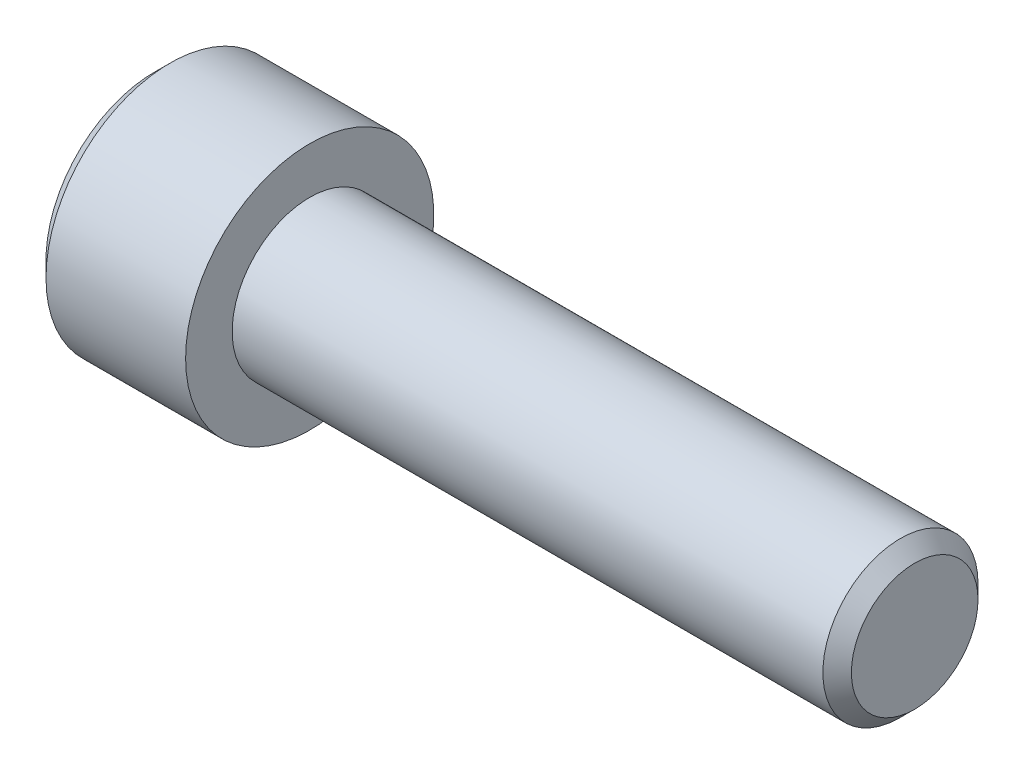
ISO-10303-21;
HEADER;
FILE_DESCRIPTION(('STEP AP214'),'2;1');
FILE_NAME('part.step','',(''),(''),'','','');
FILE_SCHEMA(('AUTOMOTIVE_DESIGN { 1 0 10303 214 1 1 1 1 }'));
ENDSEC;
DATA;
#1=APPLICATION_CONTEXT('core data for automotive mechanical design processes');
#2=APPLICATION_PROTOCOL_DEFINITION('international standard','automotive_design',2000,#1);
#3=PRODUCT_CONTEXT('',#1,'mechanical');
#4=PRODUCT('Part','Part','',(#3));
#5=PRODUCT_RELATED_PRODUCT_CATEGORY('part','',(#4));
#6=PRODUCT_DEFINITION_FORMATION('','',#4);
#7=PRODUCT_DEFINITION_CONTEXT('part definition',#1,'design');
#8=PRODUCT_DEFINITION('design','',#6,#7);
#9=PRODUCT_DEFINITION_SHAPE('','',#8);
#10=(LENGTH_UNIT() NAMED_UNIT(*) SI_UNIT(.MILLI.,.METRE.));
#11=(NAMED_UNIT(*) PLANE_ANGLE_UNIT() SI_UNIT($,.RADIAN.));
#12=(NAMED_UNIT(*) SI_UNIT($,.STERADIAN.) SOLID_ANGLE_UNIT());
#13=UNCERTAINTY_MEASURE_WITH_UNIT(LENGTH_MEASURE(1.E-05),#10,'distance_accuracy_value','');
#14=(GEOMETRIC_REPRESENTATION_CONTEXT(3) GLOBAL_UNCERTAINTY_ASSIGNED_CONTEXT((#13)) GLOBAL_UNIT_ASSIGNED_CONTEXT((#10,
#11,#12)) REPRESENTATION_CONTEXT('',''));
#15=CARTESIAN_POINT('',(0.,0.,0.));
#16=DIRECTION('',(0.,0.,1.));
#17=DIRECTION('',(1.,0.,0.));
#18=AXIS2_PLACEMENT_3D('',#15,#16,#17);
#19=CARTESIAN_POINT('',(0.,0.,0.));
#20=DIRECTION('',(1.,0.,0.));
#21=DIRECTION('',(0.,0.,-1.));
#22=AXIS2_PLACEMENT_3D('',#19,#20,#21);
#23=PLANE('',#22);
#24=CARTESIAN_POINT('',(0.,0.,0.));
#25=DIRECTION('',(1.,0.,0.));
#26=DIRECTION('',(0.,0.,-1.));
#27=AXIS2_PLACEMENT_3D('',#24,#25,#26);
#28=CIRCLE('',#27,5.);
#29=CARTESIAN_POINT('',(0.,0.,-5.));
#30=VERTEX_POINT('',#29);
#31=EDGE_CURVE('E11',#30,#30,#28,.T.);
#32=ORIENTED_EDGE('',*,*,#31,.F.);
#33=EDGE_LOOP('',(#32));
#34=FACE_BOUND('',#33,.T.);
#35=CARTESIAN_POINT('',(0.,0.,0.));
#36=DIRECTION('',(1.,0.,0.));
#37=DIRECTION('',(0.,0.,1.));
#38=AXIS2_PLACEMENT_3D('',#35,#36,#37);
#39=CIRCLE('',#38,8.);
#40=CARTESIAN_POINT('',(0.,0.,8.));
#41=VERTEX_POINT('',#40);
#42=EDGE_CURVE('E224',#41,#41,#39,.T.);
#43=ORIENTED_EDGE('',*,*,#42,.T.);
#44=EDGE_LOOP('',(#43));
#45=FACE_BOUND('',#44,.T.);
#46=ADVANCED_FACE('F43',(#34,#45),#23,.T.);
#47=CARTESIAN_POINT('',(-10.,-7.19126770361166,7.));
#48=DIRECTION('',(-1.,0.,0.));
#49=DIRECTION('',(0.,1.,0.));
#50=AXIS2_PLACEMENT_3D('',#47,#48,#49);
#51=PLANE('',#50);
#52=CARTESIAN_POINT('',(-10.,0.,0.));
#53=DIRECTION('',(-1.,0.,0.));
#54=DIRECTION('',(0.,0.,-1.));
#55=AXIS2_PLACEMENT_3D('',#52,#53,#54);
#56=CIRCLE('',#55,7.);
#57=CARTESIAN_POINT('',(-10.,0.,-7.));
#58=VERTEX_POINT('',#57);
#59=EDGE_CURVE('E46',#58,#58,#56,.F.);
#60=ORIENTED_EDGE('',*,*,#59,.F.);
#61=EDGE_LOOP('',(#60));
#62=FACE_BOUND('',#61,.T.);
#63=DIRECTION('',(0.,0.5,-0.866025403784439));
#64=VECTOR('',#63,1.);
#65=CARTESIAN_POINT('',(-10.,-4.618802153517,0.));
#66=LINE('',#65,#64);
#67=CARTESIAN_POINT('',(-10.,-4.618802153517,0.));
#68=VERTEX_POINT('',#67);
#69=CARTESIAN_POINT('',(-10.,-2.3094010767585,-4.));
#70=VERTEX_POINT('',#69);
#71=EDGE_CURVE('E200',#68,#70,#66,.T.);
#72=ORIENTED_EDGE('',*,*,#71,.T.);
#73=DIRECTION('',(0.,1.,0.));
#74=VECTOR('',#73,1.);
#75=CARTESIAN_POINT('',(-10.,-2.3094010767585,-4.));
#76=LINE('',#75,#74);
#77=CARTESIAN_POINT('',(-10.,2.3094010767585,-4.));
#78=VERTEX_POINT('',#77);
#79=EDGE_CURVE('E58',#70,#78,#76,.T.);
#80=ORIENTED_EDGE('',*,*,#79,.T.);
#81=DIRECTION('',(0.,0.5,0.866025403784439));
#82=VECTOR('',#81,1.);
#83=CARTESIAN_POINT('',(-10.,2.3094010767585,-4.));
#84=LINE('',#83,#82);
#85=CARTESIAN_POINT('',(-10.,4.618802153517,0.));
#86=VERTEX_POINT('',#85);
#87=EDGE_CURVE('E66',#78,#86,#84,.T.);
#88=ORIENTED_EDGE('',*,*,#87,.T.);
#89=DIRECTION('',(0.,-0.499999999999999,0.866025403784439));
#90=VECTOR('',#89,1.);
#91=CARTESIAN_POINT('',(-10.,4.618802153517,0.));
#92=LINE('',#91,#90);
#93=CARTESIAN_POINT('',(-10.,2.3094010767585,4.));
#94=VERTEX_POINT('',#93);
#95=EDGE_CURVE('E210',#86,#94,#92,.T.);
#96=ORIENTED_EDGE('',*,*,#95,.T.);
#97=DIRECTION('',(0.,-1.,0.));
#98=VECTOR('',#97,1.);
#99=CARTESIAN_POINT('',(-10.,2.3094010767585,4.));
#100=LINE('',#99,#98);
#101=CARTESIAN_POINT('',(-10.,-2.3094010767585,4.));
#102=VERTEX_POINT('',#101);
#103=EDGE_CURVE('E215',#94,#102,#100,.T.);
#104=ORIENTED_EDGE('',*,*,#103,.T.);
#105=DIRECTION('',(0.,-0.5,-0.866025403784439));
#106=VECTOR('',#105,1.);
#107=CARTESIAN_POINT('',(-10.,-2.3094010767585,4.));
#108=LINE('',#107,#106);
#109=EDGE_CURVE('E220',#102,#68,#108,.T.);
#110=ORIENTED_EDGE('',*,*,#109,.T.);
#111=EDGE_LOOP('',(#72,#80,#88,#96,#104,#110));
#112=FACE_BOUND('',#111,.T.);
#113=ADVANCED_FACE('F136',(#62,#112),#51,.T.);
#114=CARTESIAN_POINT('',(-5.,-2.3094010767585,4.));
#115=DIRECTION('',(0.,0.,-1.));
#116=DIRECTION('',(-1.,0.,0.));
#117=AXIS2_PLACEMENT_3D('',#114,#115,#116);
#118=PLANE('',#117);
#119=ORIENTED_EDGE('',*,*,#103,.F.);
#120=DIRECTION('',(1.,0.,0.));
#121=VECTOR('',#120,1.);
#122=CARTESIAN_POINT('',(-10.,2.3094010767585,4.));
#123=LINE('',#122,#121);
#124=CARTESIAN_POINT('',(-5.,2.3094010767585,4.));
#125=VERTEX_POINT('',#124);
#126=EDGE_CURVE('E229',#125,#94,#123,.F.);
#127=ORIENTED_EDGE('',*,*,#126,.F.);
#128=DIRECTION('',(0.,-1.,0.));
#129=VECTOR('',#128,1.);
#130=CARTESIAN_POINT('',(-5.,2.3094010767585,4.));
#131=LINE('',#130,#129);
#132=CARTESIAN_POINT('',(-5.,0.,4.));
#133=VERTEX_POINT('',#132);
#134=EDGE_CURVE('E231',#125,#133,#131,.T.);
#135=ORIENTED_EDGE('',*,*,#134,.T.);
#136=DIRECTION('',(0.,-1.,0.));
#137=VECTOR('',#136,1.);
#138=CARTESIAN_POINT('',(-5.,0.,4.));
#139=LINE('',#138,#137);
#140=CARTESIAN_POINT('',(-5.,-2.3094010767585,4.));
#141=VERTEX_POINT('',#140);
#142=EDGE_CURVE('E236',#133,#141,#139,.T.);
#143=ORIENTED_EDGE('',*,*,#142,.T.);
#144=DIRECTION('',(-1.,0.,0.));
#145=VECTOR('',#144,1.);
#146=CARTESIAN_POINT('',(-5.,-2.3094010767585,4.));
#147=LINE('',#146,#145);
#148=EDGE_CURVE('E241',#141,#102,#147,.T.);
#149=ORIENTED_EDGE('',*,*,#148,.T.);
#150=EDGE_LOOP('',(#119,#127,#135,#143,#149));
#151=FACE_BOUND('',#150,.T.);
#152=ADVANCED_FACE('F139',(#151),#118,.T.);
#153=CARTESIAN_POINT('',(-10.,-4.618802153517,0.));
#154=DIRECTION('',(0.,0.866025403784439,-0.5));
#155=DIRECTION('',(0.,0.5,0.866025403784439));
#156=AXIS2_PLACEMENT_3D('',#153,#154,#155);
#157=PLANE('',#156);
#158=ORIENTED_EDGE('',*,*,#109,.F.);
#159=ORIENTED_EDGE('',*,*,#148,.F.);
#160=DIRECTION('',(0.,-0.5,-0.866025403784439));
#161=VECTOR('',#160,1.);
#162=CARTESIAN_POINT('',(-5.,-2.3094010767585,4.));
#163=LINE('',#162,#161);
#164=CARTESIAN_POINT('',(-5.,-3.46410161513775,2.));
#165=VERTEX_POINT('',#164);
#166=EDGE_CURVE('E246',#141,#165,#163,.T.);
#167=ORIENTED_EDGE('',*,*,#166,.T.);
#168=DIRECTION('',(0.,-0.5,-0.866025403784439));
#169=VECTOR('',#168,1.);
#170=CARTESIAN_POINT('',(-5.,-3.46410161513775,2.));
#171=LINE('',#170,#169);
#172=CARTESIAN_POINT('',(-5.,-4.618802153517,0.));
#173=VERTEX_POINT('',#172);
#174=EDGE_CURVE('E251',#165,#173,#171,.T.);
#175=ORIENTED_EDGE('',*,*,#174,.T.);
#176=DIRECTION('',(-1.,0.,0.));
#177=VECTOR('',#176,1.);
#178=CARTESIAN_POINT('',(-5.,-4.618802153517,0.));
#179=LINE('',#178,#177);
#180=EDGE_CURVE('E256',#173,#68,#179,.T.);
#181=ORIENTED_EDGE('',*,*,#180,.T.);
#182=EDGE_LOOP('',(#158,#159,#167,#175,#181));
#183=FACE_BOUND('',#182,.T.);
#184=ADVANCED_FACE('F144',(#183),#157,.T.);
#185=CARTESIAN_POINT('',(-10.,-2.3094010767585,-4.));
#186=DIRECTION('',(0.,0.866025403784439,0.5));
#187=DIRECTION('',(0.,-0.5,0.866025403784439));
#188=AXIS2_PLACEMENT_3D('',#185,#186,#187);
#189=PLANE('',#188);
#190=ORIENTED_EDGE('',*,*,#71,.F.);
#191=ORIENTED_EDGE('',*,*,#180,.F.);
#192=DIRECTION('',(0.,0.5,-0.866025403784439));
#193=VECTOR('',#192,1.);
#194=CARTESIAN_POINT('',(-5.,-4.618802153517,0.));
#195=LINE('',#194,#193);
#196=CARTESIAN_POINT('',(-5.,-3.46410161513775,-2.));
#197=VERTEX_POINT('',#196);
#198=EDGE_CURVE('E261',#173,#197,#195,.T.);
#199=ORIENTED_EDGE('',*,*,#198,.T.);
#200=DIRECTION('',(0.,0.5,-0.866025403784439));
#201=VECTOR('',#200,1.);
#202=CARTESIAN_POINT('',(-5.,-3.46410161513775,-2.));
#203=LINE('',#202,#201);
#204=CARTESIAN_POINT('',(-5.,-2.3094010767585,-4.));
#205=VERTEX_POINT('',#204);
#206=EDGE_CURVE('E266',#197,#205,#203,.T.);
#207=ORIENTED_EDGE('',*,*,#206,.T.);
#208=DIRECTION('',(-1.,0.,0.));
#209=VECTOR('',#208,1.);
#210=CARTESIAN_POINT('',(-5.,-2.3094010767585,-4.));
#211=LINE('',#210,#209);
#212=EDGE_CURVE('E271',#205,#70,#211,.T.);
#213=ORIENTED_EDGE('',*,*,#212,.T.);
#214=EDGE_LOOP('',(#190,#191,#199,#207,#213));
#215=FACE_BOUND('',#214,.T.);
#216=ADVANCED_FACE('F152',(#215),#189,.T.);
#217=CARTESIAN_POINT('',(-10.,-2.3094010767585,-4.));
#218=DIRECTION('',(0.,0.,1.));
#219=DIRECTION('',(1.,0.,0.));
#220=AXIS2_PLACEMENT_3D('',#217,#218,#219);
#221=PLANE('',#220);
#222=ORIENTED_EDGE('',*,*,#79,.F.);
#223=ORIENTED_EDGE('',*,*,#212,.F.);
#224=DIRECTION('',(0.,1.,0.));
#225=VECTOR('',#224,1.);
#226=CARTESIAN_POINT('',(-5.,-2.3094010767585,-4.));
#227=LINE('',#226,#225);
#228=CARTESIAN_POINT('',(-5.,0.,-4.));
#229=VERTEX_POINT('',#228);
#230=EDGE_CURVE('E275',#205,#229,#227,.T.);
#231=ORIENTED_EDGE('',*,*,#230,.T.);
#232=DIRECTION('',(0.,1.,0.));
#233=VECTOR('',#232,1.);
#234=CARTESIAN_POINT('',(-5.,0.,-4.));
#235=LINE('',#234,#233);
#236=CARTESIAN_POINT('',(-5.,2.3094010767585,-4.));
#237=VERTEX_POINT('',#236);
#238=EDGE_CURVE('E280',#229,#237,#235,.T.);
#239=ORIENTED_EDGE('',*,*,#238,.T.);
#240=DIRECTION('',(-1.,0.,0.));
#241=VECTOR('',#240,1.);
#242=CARTESIAN_POINT('',(-5.,2.3094010767585,-4.));
#243=LINE('',#242,#241);
#244=EDGE_CURVE('E285',#237,#78,#243,.T.);
#245=ORIENTED_EDGE('',*,*,#244,.T.);
#246=EDGE_LOOP('',(#222,#223,#231,#239,#245));
#247=FACE_BOUND('',#246,.T.);
#248=ADVANCED_FACE('F156',(#247),#221,.T.);
#249=CARTESIAN_POINT('',(-10.,4.618802153517,0.));
#250=DIRECTION('',(0.,-0.866025403784439,0.5));
#251=DIRECTION('',(0.,-0.5,-0.866025403784439));
#252=AXIS2_PLACEMENT_3D('',#249,#250,#251);
#253=PLANE('',#252);
#254=ORIENTED_EDGE('',*,*,#87,.F.);
#255=ORIENTED_EDGE('',*,*,#244,.F.);
#256=DIRECTION('',(0.,0.5,0.866025403784439));
#257=VECTOR('',#256,1.);
#258=CARTESIAN_POINT('',(-5.,2.3094010767585,-4.));
#259=LINE('',#258,#257);
#260=CARTESIAN_POINT('',(-5.,3.46410161513775,-2.));
#261=VERTEX_POINT('',#260);
#262=EDGE_CURVE('E289',#237,#261,#259,.T.);
#263=ORIENTED_EDGE('',*,*,#262,.T.);
#264=DIRECTION('',(0.,0.5,0.866025403784439));
#265=VECTOR('',#264,1.);
#266=CARTESIAN_POINT('',(-5.,3.46410161513775,-2.));
#267=LINE('',#266,#265);
#268=CARTESIAN_POINT('',(-5.,4.618802153517,0.));
#269=VERTEX_POINT('',#268);
#270=EDGE_CURVE('E294',#261,#269,#267,.T.);
#271=ORIENTED_EDGE('',*,*,#270,.T.);
#272=DIRECTION('',(-1.,0.,0.));
#273=VECTOR('',#272,1.);
#274=CARTESIAN_POINT('',(-5.,4.618802153517,0.));
#275=LINE('',#274,#273);
#276=EDGE_CURVE('E299',#269,#86,#275,.T.);
#277=ORIENTED_EDGE('',*,*,#276,.T.);
#278=EDGE_LOOP('',(#254,#255,#263,#271,#277));
#279=FACE_BOUND('',#278,.T.);
#280=ADVANCED_FACE('F160',(#279),#253,.T.);
#281=CARTESIAN_POINT('',(-10.,2.3094010767585,4.));
#282=DIRECTION('',(0.,-0.866025403784439,-0.5));
#283=DIRECTION('',(0.,0.5,-0.866025403784439));
#284=AXIS2_PLACEMENT_3D('',#281,#282,#283);
#285=PLANE('',#284);
#286=ORIENTED_EDGE('',*,*,#95,.F.);
#287=ORIENTED_EDGE('',*,*,#276,.F.);
#288=DIRECTION('',(0.,-0.5,0.866025403784439));
#289=VECTOR('',#288,1.);
#290=CARTESIAN_POINT('',(-5.,4.618802153517,0.));
#291=LINE('',#290,#289);
#292=CARTESIAN_POINT('',(-5.,3.46410161513775,2.));
#293=VERTEX_POINT('',#292);
#294=EDGE_CURVE('E303',#269,#293,#291,.T.);
#295=ORIENTED_EDGE('',*,*,#294,.T.);
#296=DIRECTION('',(0.,-0.5,0.866025403784439));
#297=VECTOR('',#296,1.);
#298=CARTESIAN_POINT('',(-5.,3.46410161513775,2.));
#299=LINE('',#298,#297);
#300=EDGE_CURVE('E308',#293,#125,#299,.T.);
#301=ORIENTED_EDGE('',*,*,#300,.T.);
#302=ORIENTED_EDGE('',*,*,#126,.T.);
#303=EDGE_LOOP('',(#286,#287,#295,#301,#302));
#304=FACE_BOUND('',#303,.T.);
#305=ADVANCED_FACE('F163',(#304),#285,.T.);
#306=CARTESIAN_POINT('',(-5.,0.,-2.));
#307=DIRECTION('',(-1.,0.,0.));
#308=DIRECTION('',(0.,1.,0.));
#309=AXIS2_PLACEMENT_3D('',#306,#307,#308);
#310=PLANE('',#309);
#311=CARTESIAN_POINT('',(-5.,0.,0.));
#312=DIRECTION('',(1.,0.,0.));
#313=DIRECTION('',(0.,0.,-1.));
#314=AXIS2_PLACEMENT_3D('',#311,#312,#313);
#315=CIRCLE('',#314,4.);
#316=EDGE_CURVE('E313',#229,#261,#315,.T.);
#317=ORIENTED_EDGE('',*,*,#316,.T.);
#318=ORIENTED_EDGE('',*,*,#262,.F.);
#319=ORIENTED_EDGE('',*,*,#238,.F.);
#320=EDGE_LOOP('',(#317,#318,#319));
#321=FACE_BOUND('',#320,.T.);
#322=ADVANCED_FACE('F166',(#321),#310,.T.);
#323=CARTESIAN_POINT('',(-5.,3.46410161513775,2.));
#324=DIRECTION('',(-1.,0.,0.));
#325=DIRECTION('',(0.,1.,0.));
#326=AXIS2_PLACEMENT_3D('',#323,#324,#325);
#327=PLANE('',#326);
#328=ORIENTED_EDGE('',*,*,#270,.F.);
#329=CARTESIAN_POINT('',(-5.,0.,0.));
#330=DIRECTION('',(1.,0.,0.));
#331=DIRECTION('',(0.,0.866025403784439,-0.5));
#332=AXIS2_PLACEMENT_3D('',#329,#330,#331);
#333=CIRCLE('',#332,4.);
#334=EDGE_CURVE('E318',#261,#293,#333,.T.);
#335=ORIENTED_EDGE('',*,*,#334,.T.);
#336=ORIENTED_EDGE('',*,*,#294,.F.);
#337=EDGE_LOOP('',(#328,#335,#336));
#338=FACE_BOUND('',#337,.T.);
#339=ADVANCED_FACE('F170',(#338),#327,.T.);
#340=CARTESIAN_POINT('',(-5.,0.,4.));
#341=DIRECTION('',(-1.,0.,0.));
#342=DIRECTION('',(0.,1.,0.));
#343=AXIS2_PLACEMENT_3D('',#340,#341,#342);
#344=PLANE('',#343);
#345=CARTESIAN_POINT('',(-5.,0.,0.));
#346=DIRECTION('',(1.,0.,0.));
#347=DIRECTION('',(0.,0.866025403784438,0.500000000000001));
#348=AXIS2_PLACEMENT_3D('',#345,#346,#347);
#349=CIRCLE('',#348,4.);
#350=EDGE_CURVE('E323',#293,#133,#349,.T.);
#351=ORIENTED_EDGE('',*,*,#350,.T.);
#352=ORIENTED_EDGE('',*,*,#134,.F.);
#353=ORIENTED_EDGE('',*,*,#300,.F.);
#354=EDGE_LOOP('',(#351,#352,#353));
#355=FACE_BOUND('',#354,.T.);
#356=ADVANCED_FACE('F174',(#355),#344,.T.);
#357=CARTESIAN_POINT('',(-5.,-3.46410161513775,4.));
#358=DIRECTION('',(-1.,0.,0.));
#359=DIRECTION('',(0.,1.,0.));
#360=AXIS2_PLACEMENT_3D('',#357,#358,#359);
#361=PLANE('',#360);
#362=CARTESIAN_POINT('',(-5.,0.,0.));
#363=DIRECTION('',(1.,0.,0.));
#364=DIRECTION('',(0.,0.,1.));
#365=AXIS2_PLACEMENT_3D('',#362,#363,#364);
#366=CIRCLE('',#365,4.);
#367=EDGE_CURVE('E328',#133,#165,#366,.T.);
#368=ORIENTED_EDGE('',*,*,#367,.T.);
#369=ORIENTED_EDGE('',*,*,#166,.F.);
#370=ORIENTED_EDGE('',*,*,#142,.F.);
#371=EDGE_LOOP('',(#368,#369,#370));
#372=FACE_BOUND('',#371,.T.);
#373=ADVANCED_FACE('F178',(#372),#361,.T.);
#374=CARTESIAN_POINT('',(-5.,-4.618802153517,2.));
#375=DIRECTION('',(-1.,0.,0.));
#376=DIRECTION('',(0.,1.,0.));
#377=AXIS2_PLACEMENT_3D('',#374,#375,#376);
#378=PLANE('',#377);
#379=CARTESIAN_POINT('',(-5.,0.,0.));
#380=DIRECTION('',(1.,0.,0.));
#381=DIRECTION('',(0.,-0.866025403784438,0.500000000000001));
#382=AXIS2_PLACEMENT_3D('',#379,#380,#381);
#383=CIRCLE('',#382,4.);
#384=EDGE_CURVE('E333',#165,#197,#383,.T.);
#385=ORIENTED_EDGE('',*,*,#384,.T.);
#386=ORIENTED_EDGE('',*,*,#198,.F.);
#387=ORIENTED_EDGE('',*,*,#174,.F.);
#388=EDGE_LOOP('',(#385,#386,#387));
#389=FACE_BOUND('',#388,.T.);
#390=ADVANCED_FACE('F182',(#389),#378,.T.);
#391=CARTESIAN_POINT('',(-5.,-3.46410161513776,-2.));
#392=DIRECTION('',(-1.,0.,0.));
#393=DIRECTION('',(0.,1.,0.));
#394=AXIS2_PLACEMENT_3D('',#391,#392,#393);
#395=PLANE('',#394);
#396=CARTESIAN_POINT('',(-5.,0.,0.));
#397=DIRECTION('',(1.,0.,0.));
#398=DIRECTION('',(0.,-0.866025403784439,-0.5));
#399=AXIS2_PLACEMENT_3D('',#396,#397,#398);
#400=CIRCLE('',#399,4.);
#401=EDGE_CURVE('E338',#197,#229,#400,.T.);
#402=ORIENTED_EDGE('',*,*,#401,.T.);
#403=ORIENTED_EDGE('',*,*,#230,.F.);
#404=ORIENTED_EDGE('',*,*,#206,.F.);
#405=EDGE_LOOP('',(#402,#403,#404));
#406=FACE_BOUND('',#405,.T.);
#407=ADVANCED_FACE('F186',(#406),#395,.T.);
#408=CARTESIAN_POINT('',(-9.,0.,0.));
#409=DIRECTION('',(1.,0.,0.));
#410=DIRECTION('',(0.,1.92328497912594E-10,1.));
#411=AXIS2_PLACEMENT_3D('',#408,#409,#410);
#412=CONICAL_SURFACE('',#411,8.,0.785398163397447);
#413=CARTESIAN_POINT('',(-9.,0.,0.));
#414=DIRECTION('',(-1.,0.,0.));
#415=DIRECTION('',(0.,0.,-1.));
#416=AXIS2_PLACEMENT_3D('',#413,#414,#415);
#417=CIRCLE('',#416,8.);
#418=CARTESIAN_POINT('',(-9.,0.,-8.));
#419=VERTEX_POINT('',#418);
#420=EDGE_CURVE('E198',#419,#419,#417,.F.);
#421=ORIENTED_EDGE('',*,*,#420,.F.);
#422=EDGE_LOOP('',(#421));
#423=FACE_BOUND('',#422,.T.);
#424=ORIENTED_EDGE('',*,*,#59,.T.);
#425=EDGE_LOOP('',(#424));
#426=FACE_BOUND('',#425,.T.);
#427=ADVANCED_FACE('F133',(#423,#426),#412,.T.);
#428=CARTESIAN_POINT('',(30.,0.,0.));
#429=DIRECTION('',(1.,0.,0.));
#430=DIRECTION('',(0.,7.69313624256337E-10,1.));
#431=AXIS2_PLACEMENT_3D('',#428,#429,#430);
#432=CYLINDRICAL_SURFACE('',#431,8.);
#433=ORIENTED_EDGE('',*,*,#42,.F.);
#434=EDGE_LOOP('',(#433));
#435=FACE_BOUND('',#434,.T.);
#436=ORIENTED_EDGE('',*,*,#420,.T.);
#437=EDGE_LOOP('',(#436));
#438=FACE_BOUND('',#437,.T.);
#439=ADVANCED_FACE('F121',(#435,#438),#432,.T.);
#440=CARTESIAN_POINT('',(-5.,0.,0.));
#441=DIRECTION('',(-1.,0.,0.));
#442=DIRECTION('',(0.,0.,-1.));
#443=AXIS2_PLACEMENT_3D('',#440,#441,#442);
#444=CONICAL_SURFACE('',#443,4.,1.0471975511966);
#445=ORIENTED_EDGE('',*,*,#401,.F.);
#446=ORIENTED_EDGE('',*,*,#384,.F.);
#447=ORIENTED_EDGE('',*,*,#367,.F.);
#448=ORIENTED_EDGE('',*,*,#350,.F.);
#449=ORIENTED_EDGE('',*,*,#334,.F.);
#450=ORIENTED_EDGE('',*,*,#316,.F.);
#451=EDGE_LOOP('',(#445,#446,#447,#448,#449,#450));
#452=FACE_BOUND('',#451,.T.);
#453=CARTESIAN_POINT('',(-2.6905989232415,0.,0.));
#454=VERTEX_POINT('',#453);
#455=VERTEX_LOOP('',#454);
#456=FACE_BOUND('',#455,.T.);
#457=ADVANCED_FACE('F118',(#452,#456),#444,.F.);
#458=CARTESIAN_POINT('',(-14.142135623731,0.,0.));
#459=DIRECTION('',(1.,0.,0.));
#460=DIRECTION('',(0.,0.,-1.));
#461=AXIS2_PLACEMENT_3D('',#458,#459,#460);
#462=CYLINDRICAL_SURFACE('',#461,5.);
#463=ORIENTED_EDGE('',*,*,#31,.T.);
#464=EDGE_LOOP('',(#463));
#465=FACE_BOUND('',#464,.T.);
#466=CARTESIAN_POINT('',(38.08,0.,0.));
#467=DIRECTION('',(-1.,0.,0.));
#468=DIRECTION('',(0.,0.,-1.));
#469=AXIS2_PLACEMENT_3D('',#466,#467,#468);
#470=CIRCLE('',#469,5.);
#471=CARTESIAN_POINT('',(38.08,0.,-5.));
#472=VERTEX_POINT('',#471);
#473=EDGE_CURVE('E345',#472,#472,#470,.F.);
#474=ORIENTED_EDGE('',*,*,#473,.F.);
#475=EDGE_LOOP('',(#474));
#476=FACE_BOUND('',#475,.T.);
#477=ADVANCED_FACE('F120',(#465,#476),#462,.T.);
#478=CARTESIAN_POINT('',(39.,-4.07999980192479,-4.08000000000001));
#479=DIRECTION('',(1.,0.,0.));
#480=DIRECTION('',(0.,1.,0.));
#481=AXIS2_PLACEMENT_3D('',#478,#479,#480);
#482=PLANE('',#481);
#483=CARTESIAN_POINT('',(39.,0.,0.));
#484=DIRECTION('',(1.,0.,0.));
#485=DIRECTION('',(0.,-1.42331231550175E-07,0.99999999999999));
#486=AXIS2_PLACEMENT_3D('',#483,#484,#485);
#487=CIRCLE('',#486,4.08);
#488=CARTESIAN_POINT('',(39.,-5.80711424724716E-07,4.07999999999996));
#489=VERTEX_POINT('',#488);
#490=EDGE_CURVE('E349',#489,#489,#487,.T.);
#491=ORIENTED_EDGE('',*,*,#490,.T.);
#492=EDGE_LOOP('',(#491));
#493=FACE_BOUND('',#492,.T.);
#494=ADVANCED_FACE('F129',(#493),#482,.T.);
#495=CARTESIAN_POINT('',(38.08,0.,0.));
#496=DIRECTION('',(-1.,0.,0.));
#497=DIRECTION('',(0.,0.,-1.));
#498=AXIS2_PLACEMENT_3D('',#495,#496,#497);
#499=CONICAL_SURFACE('',#498,5.,0.785398163397447);
#500=ORIENTED_EDGE('',*,*,#490,.F.);
#501=EDGE_LOOP('',(#500));
#502=FACE_BOUND('',#501,.T.);
#503=ORIENTED_EDGE('',*,*,#473,.T.);
#504=EDGE_LOOP('',(#503));
#505=FACE_BOUND('',#504,.T.);
#506=ADVANCED_FACE('F132',(#502,#505),#499,.T.);
#507=CLOSED_SHELL('',(#46,#113,#152,#184,#216,#248,#280,#305,#322,#339,#356,#373,#390,#407,#427,
#439,#457,#477,#494,#506));
#508=MANIFOLD_SOLID_BREP('B2',#507);
#509=ADVANCED_BREP_SHAPE_REPRESENTATION('',(#18,#508),#14);
#510=SHAPE_DEFINITION_REPRESENTATION(#9,#509);
ENDSEC;
END-ISO-10303-21;
